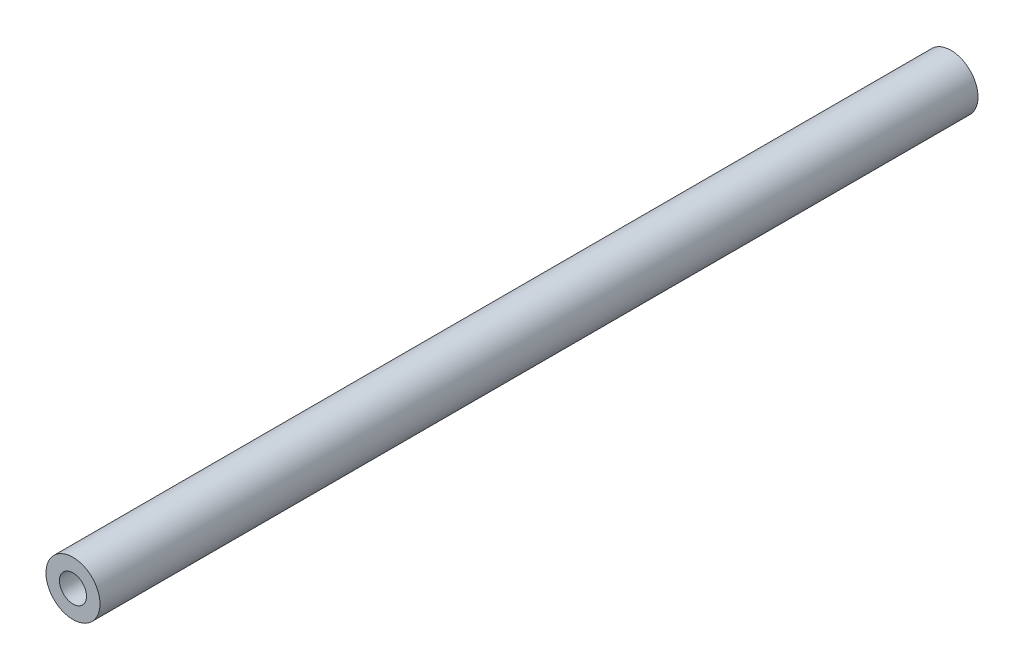
ISO-10303-21;
HEADER;
FILE_DESCRIPTION(('STEP AP214'),'2;1');
FILE_NAME('part.step','',(''),(''),'','','');
FILE_SCHEMA(('AUTOMOTIVE_DESIGN { 1 0 10303 214 1 1 1 1 }'));
ENDSEC;
DATA;
#1=APPLICATION_CONTEXT('core data for automotive mechanical design processes');
#2=APPLICATION_PROTOCOL_DEFINITION('international standard','automotive_design',2000,#1);
#3=PRODUCT_CONTEXT('',#1,'mechanical');
#4=PRODUCT('Part','Part','',(#3));
#5=PRODUCT_RELATED_PRODUCT_CATEGORY('part','',(#4));
#6=PRODUCT_DEFINITION_FORMATION('','',#4);
#7=PRODUCT_DEFINITION_CONTEXT('part definition',#1,'design');
#8=PRODUCT_DEFINITION('design','',#6,#7);
#9=PRODUCT_DEFINITION_SHAPE('','',#8);
#10=(LENGTH_UNIT() NAMED_UNIT(*) SI_UNIT(.MILLI.,.METRE.));
#11=(NAMED_UNIT(*) PLANE_ANGLE_UNIT() SI_UNIT($,.RADIAN.));
#12=(NAMED_UNIT(*) SI_UNIT($,.STERADIAN.) SOLID_ANGLE_UNIT());
#13=UNCERTAINTY_MEASURE_WITH_UNIT(LENGTH_MEASURE(1.E-05),#10,'distance_accuracy_value','');
#14=(GEOMETRIC_REPRESENTATION_CONTEXT(3) GLOBAL_UNCERTAINTY_ASSIGNED_CONTEXT((#13)) GLOBAL_UNIT_ASSIGNED_CONTEXT((#10,
#11,#12)) REPRESENTATION_CONTEXT('',''));
#15=CARTESIAN_POINT('',(0.,0.,0.));
#16=DIRECTION('',(0.,0.,1.));
#17=DIRECTION('',(1.,0.,0.));
#18=AXIS2_PLACEMENT_3D('',#15,#16,#17);
#19=CARTESIAN_POINT('',(0.,0.,260.));
#20=DIRECTION('',(0.,0.,-1.));
#21=DIRECTION('',(-1.,0.,0.));
#22=AXIS2_PLACEMENT_3D('',#19,#20,#21);
#23=CYLINDRICAL_SURFACE('',#22,8.);
#24=CARTESIAN_POINT('',(0.,0.,260.));
#25=DIRECTION('',(0.,0.,1.));
#26=DIRECTION('',(1.,0.,0.));
#27=AXIS2_PLACEMENT_3D('',#24,#25,#26);
#28=CIRCLE('',#27,8.);
#29=CARTESIAN_POINT('',(8.,0.,260.));
#30=VERTEX_POINT('',#29);
#31=EDGE_CURVE('E12',#30,#30,#28,.T.);
#32=ORIENTED_EDGE('',*,*,#31,.F.);
#33=EDGE_LOOP('',(#32));
#34=FACE_BOUND('',#33,.T.);
#35=CARTESIAN_POINT('',(0.,0.,0.));
#36=DIRECTION('',(0.,0.,1.));
#37=DIRECTION('',(1.,0.,0.));
#38=AXIS2_PLACEMENT_3D('',#35,#36,#37);
#39=CIRCLE('',#38,8.);
#40=CARTESIAN_POINT('',(8.,0.,0.));
#41=VERTEX_POINT('',#40);
#42=EDGE_CURVE('E47',#41,#41,#39,.T.);
#43=ORIENTED_EDGE('',*,*,#42,.T.);
#44=EDGE_LOOP('',(#43));
#45=FACE_BOUND('',#44,.T.);
#46=ADVANCED_FACE('F44',(#34,#45),#23,.T.);
#47=CARTESIAN_POINT('',(0.,0.,260.));
#48=DIRECTION('',(0.,0.,1.));
#49=DIRECTION('',(1.,0.,0.));
#50=AXIS2_PLACEMENT_3D('',#47,#48,#49);
#51=PLANE('',#50);
#52=CARTESIAN_POINT('',(0.,0.,260.));
#53=DIRECTION('',(0.,0.,1.));
#54=DIRECTION('',(1.,0.,0.));
#55=AXIS2_PLACEMENT_3D('',#52,#53,#54);
#56=CIRCLE('',#55,4.);
#57=CARTESIAN_POINT('',(4.,0.,260.));
#58=VERTEX_POINT('',#57);
#59=EDGE_CURVE('E56',#58,#58,#56,.T.);
#60=ORIENTED_EDGE('',*,*,#59,.F.);
#61=EDGE_LOOP('',(#60));
#62=FACE_BOUND('',#61,.T.);
#63=ORIENTED_EDGE('',*,*,#31,.T.);
#64=EDGE_LOOP('',(#63));
#65=FACE_BOUND('',#64,.T.);
#66=ADVANCED_FACE('F81',(#62,#65),#51,.T.);
#67=CARTESIAN_POINT('',(0.,0.,0.));
#68=DIRECTION('',(0.,0.,1.));
#69=DIRECTION('',(1.,0.,0.));
#70=AXIS2_PLACEMENT_3D('',#67,#68,#69);
#71=PLANE('',#70);
#72=CARTESIAN_POINT('',(0.,0.,0.));
#73=DIRECTION('',(0.,0.,-1.));
#74=DIRECTION('',(-1.,0.,0.));
#75=AXIS2_PLACEMENT_3D('',#72,#73,#74);
#76=CIRCLE('',#75,4.);
#77=CARTESIAN_POINT('',(-4.,0.,0.));
#78=VERTEX_POINT('',#77);
#79=EDGE_CURVE('E62',#78,#78,#76,.T.);
#80=ORIENTED_EDGE('',*,*,#79,.F.);
#81=EDGE_LOOP('',(#80));
#82=FACE_BOUND('',#81,.T.);
#83=ORIENTED_EDGE('',*,*,#42,.F.);
#84=EDGE_LOOP('',(#83));
#85=FACE_BOUND('',#84,.T.);
#86=ADVANCED_FACE('F77',(#82,#85),#71,.F.);
#87=CARTESIAN_POINT('',(0.,0.,240.));
#88=DIRECTION('',(0.,0.,1.));
#89=DIRECTION('',(1.,0.,0.));
#90=AXIS2_PLACEMENT_3D('',#87,#88,#89);
#91=CYLINDRICAL_SURFACE('',#90,4.);
#92=CARTESIAN_POINT('',(0.,0.,240.));
#93=DIRECTION('',(0.,0.,1.));
#94=DIRECTION('',(1.,0.,0.));
#95=AXIS2_PLACEMENT_3D('',#92,#93,#94);
#96=CIRCLE('',#95,4.);
#97=CARTESIAN_POINT('',(4.,0.,240.));
#98=VERTEX_POINT('',#97);
#99=EDGE_CURVE('E54',#98,#98,#96,.T.);
#100=ORIENTED_EDGE('',*,*,#99,.F.);
#101=EDGE_LOOP('',(#100));
#102=FACE_BOUND('',#101,.T.);
#103=ORIENTED_EDGE('',*,*,#59,.T.);
#104=EDGE_LOOP('',(#103));
#105=FACE_BOUND('',#104,.T.);
#106=ADVANCED_FACE('F80',(#102,#105),#91,.F.);
#107=CARTESIAN_POINT('',(0.,0.,240.));
#108=DIRECTION('',(0.,0.,1.));
#109=DIRECTION('',(1.,0.,0.));
#110=AXIS2_PLACEMENT_3D('',#107,#108,#109);
#111=PLANE('',#110);
#112=ORIENTED_EDGE('',*,*,#99,.T.);
#113=EDGE_LOOP('',(#112));
#114=FACE_BOUND('',#113,.T.);
#115=ADVANCED_FACE('F73',(#114),#111,.T.);
#116=CARTESIAN_POINT('',(0.,0.,20.));
#117=DIRECTION('',(0.,0.,-1.));
#118=DIRECTION('',(-1.,0.,0.));
#119=AXIS2_PLACEMENT_3D('',#116,#117,#118);
#120=CYLINDRICAL_SURFACE('',#119,4.);
#121=CARTESIAN_POINT('',(0.,0.,20.));
#122=DIRECTION('',(0.,0.,-1.));
#123=DIRECTION('',(-1.,0.,0.));
#124=AXIS2_PLACEMENT_3D('',#121,#122,#123);
#125=CIRCLE('',#124,4.);
#126=CARTESIAN_POINT('',(-4.,0.,20.));
#127=VERTEX_POINT('',#126);
#128=EDGE_CURVE('E59',#127,#127,#125,.T.);
#129=ORIENTED_EDGE('',*,*,#128,.F.);
#130=EDGE_LOOP('',(#129));
#131=FACE_BOUND('',#130,.T.);
#132=ORIENTED_EDGE('',*,*,#79,.T.);
#133=EDGE_LOOP('',(#132));
#134=FACE_BOUND('',#133,.T.);
#135=ADVANCED_FACE('F70',(#131,#134),#120,.F.);
#136=CARTESIAN_POINT('',(0.,0.,20.));
#137=DIRECTION('',(0.,0.,-1.));
#138=DIRECTION('',(-1.,0.,0.));
#139=AXIS2_PLACEMENT_3D('',#136,#137,#138);
#140=PLANE('',#139);
#141=ORIENTED_EDGE('',*,*,#128,.T.);
#142=EDGE_LOOP('',(#141));
#143=FACE_BOUND('',#142,.T.);
#144=ADVANCED_FACE('F68',(#143),#140,.T.);
#145=CLOSED_SHELL('',(#46,#66,#86,#106,#115,#135,#144));
#146=MANIFOLD_SOLID_BREP('B2',#145);
#147=ADVANCED_BREP_SHAPE_REPRESENTATION('',(#18,#146),#14);
#148=SHAPE_DEFINITION_REPRESENTATION(#9,#147);
ENDSEC;
END-ISO-10303-21;
